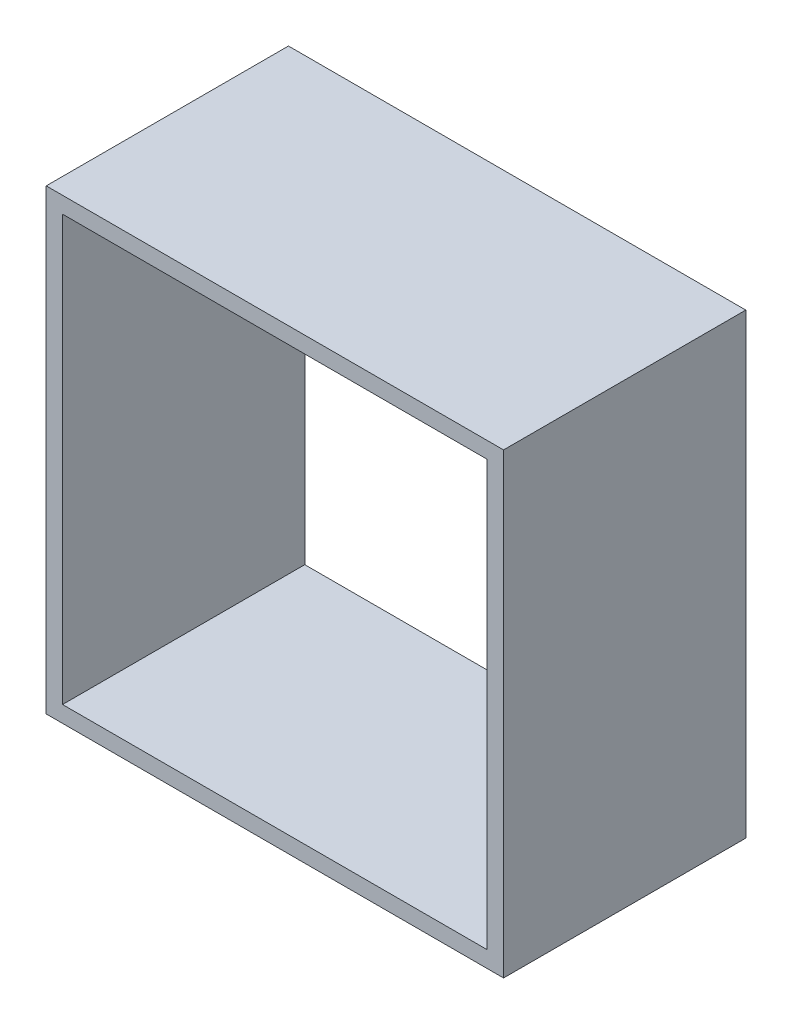
ISO-10303-21;
HEADER;
FILE_DESCRIPTION(('STEP AP214'),'2;1');
FILE_NAME('part.step','',(''),(''),'','','');
FILE_SCHEMA(('AUTOMOTIVE_DESIGN { 1 0 10303 214 1 1 1 1 }'));
ENDSEC;
DATA;
#1=APPLICATION_CONTEXT('core data for automotive mechanical design processes');
#2=APPLICATION_PROTOCOL_DEFINITION('international standard','automotive_design',2000,#1);
#3=PRODUCT_CONTEXT('',#1,'mechanical');
#4=PRODUCT('Part','Part','',(#3));
#5=PRODUCT_RELATED_PRODUCT_CATEGORY('part','',(#4));
#6=PRODUCT_DEFINITION_FORMATION('','',#4);
#7=PRODUCT_DEFINITION_CONTEXT('part definition',#1,'design');
#8=PRODUCT_DEFINITION('design','',#6,#7);
#9=PRODUCT_DEFINITION_SHAPE('','',#8);
#10=(LENGTH_UNIT() NAMED_UNIT(*) SI_UNIT(.MILLI.,.METRE.));
#11=(NAMED_UNIT(*) PLANE_ANGLE_UNIT() SI_UNIT($,.RADIAN.));
#12=(NAMED_UNIT(*) SI_UNIT($,.STERADIAN.) SOLID_ANGLE_UNIT());
#13=UNCERTAINTY_MEASURE_WITH_UNIT(LENGTH_MEASURE(1.E-05),#10,'distance_accuracy_value','');
#14=(GEOMETRIC_REPRESENTATION_CONTEXT(3) GLOBAL_UNCERTAINTY_ASSIGNED_CONTEXT((#13)) GLOBAL_UNIT_ASSIGNED_CONTEXT((#10,
#11,#12)) REPRESENTATION_CONTEXT('',''));
#15=CARTESIAN_POINT('',(0.,0.,0.));
#16=DIRECTION('',(0.,0.,1.));
#17=DIRECTION('',(1.,0.,0.));
#18=AXIS2_PLACEMENT_3D('',#15,#16,#17);
#19=CARTESIAN_POINT('',(-14.,-14.,14.83));
#20=DIRECTION('',(1.,0.,0.));
#21=DIRECTION('',(0.,0.,-1.));
#22=AXIS2_PLACEMENT_3D('',#19,#20,#21);
#23=PLANE('',#22);
#24=DIRECTION('',(0.,-1.,0.));
#25=VECTOR('',#24,1.);
#26=CARTESIAN_POINT('',(-14.,-14.,0.));
#27=LINE('',#26,#25);
#28=CARTESIAN_POINT('',(-14.,14.,0.));
#29=VERTEX_POINT('',#28);
#30=CARTESIAN_POINT('',(-14.,-14.,0.));
#31=VERTEX_POINT('',#30);
#32=EDGE_CURVE('E132',#29,#31,#27,.T.);
#33=ORIENTED_EDGE('',*,*,#32,.T.);
#34=DIRECTION('',(0.,0.,-1.));
#35=VECTOR('',#34,1.);
#36=CARTESIAN_POINT('',(-14.,-14.,14.83));
#37=LINE('',#36,#35);
#38=CARTESIAN_POINT('',(-14.,-14.,14.83));
#39=VERTEX_POINT('',#38);
#40=EDGE_CURVE('E161',#39,#31,#37,.T.);
#41=ORIENTED_EDGE('',*,*,#40,.F.);
#42=DIRECTION('',(0.,-1.,0.));
#43=VECTOR('',#42,1.);
#44=CARTESIAN_POINT('',(-14.,-14.,14.83));
#45=LINE('',#44,#43);
#46=CARTESIAN_POINT('',(-14.,14.,14.83));
#47=VERTEX_POINT('',#46);
#48=EDGE_CURVE('E135',#47,#39,#45,.T.);
#49=ORIENTED_EDGE('',*,*,#48,.F.);
#50=DIRECTION('',(0.,0.,-1.));
#51=VECTOR('',#50,1.);
#52=CARTESIAN_POINT('',(-14.,14.,14.83));
#53=LINE('',#52,#51);
#54=EDGE_CURVE('E145',#47,#29,#53,.T.);
#55=ORIENTED_EDGE('',*,*,#54,.T.);
#56=EDGE_LOOP('',(#33,#41,#49,#55));
#57=FACE_BOUND('',#56,.T.);
#58=ADVANCED_FACE('F43',(#57),#23,.F.);
#59=CARTESIAN_POINT('',(-14.,-14.,14.83));
#60=DIRECTION('',(0.,1.,0.));
#61=DIRECTION('',(0.,0.,1.));
#62=AXIS2_PLACEMENT_3D('',#59,#60,#61);
#63=PLANE('',#62);
#64=DIRECTION('',(1.,0.,0.));
#65=VECTOR('',#64,1.);
#66=CARTESIAN_POINT('',(-14.,-14.,0.));
#67=LINE('',#66,#65);
#68=CARTESIAN_POINT('',(14.,-14.,0.));
#69=VERTEX_POINT('',#68);
#70=EDGE_CURVE('E148',#31,#69,#67,.T.);
#71=ORIENTED_EDGE('',*,*,#70,.T.);
#72=DIRECTION('',(0.,0.,-1.));
#73=VECTOR('',#72,1.);
#74=CARTESIAN_POINT('',(14.,-14.,14.83));
#75=LINE('',#74,#73);
#76=CARTESIAN_POINT('',(14.,-14.,14.83));
#77=VERTEX_POINT('',#76);
#78=EDGE_CURVE('E158',#77,#69,#75,.T.);
#79=ORIENTED_EDGE('',*,*,#78,.F.);
#80=DIRECTION('',(1.,0.,0.));
#81=VECTOR('',#80,1.);
#82=CARTESIAN_POINT('',(-14.,-14.,14.83));
#83=LINE('',#82,#81);
#84=EDGE_CURVE('E138',#39,#77,#83,.T.);
#85=ORIENTED_EDGE('',*,*,#84,.F.);
#86=ORIENTED_EDGE('',*,*,#40,.T.);
#87=EDGE_LOOP('',(#71,#79,#85,#86));
#88=FACE_BOUND('',#87,.T.);
#89=ADVANCED_FACE('F186',(#88),#63,.F.);
#90=CARTESIAN_POINT('',(14.,-14.,14.83));
#91=DIRECTION('',(-1.,0.,0.));
#92=DIRECTION('',(0.,0.,1.));
#93=AXIS2_PLACEMENT_3D('',#90,#91,#92);
#94=PLANE('',#93);
#95=DIRECTION('',(0.,1.,0.));
#96=VECTOR('',#95,1.);
#97=CARTESIAN_POINT('',(14.,-14.,0.));
#98=LINE('',#97,#96);
#99=CARTESIAN_POINT('',(14.,14.,0.));
#100=VERTEX_POINT('',#99);
#101=EDGE_CURVE('E150',#69,#100,#98,.T.);
#102=ORIENTED_EDGE('',*,*,#101,.T.);
#103=DIRECTION('',(0.,0.,-1.));
#104=VECTOR('',#103,1.);
#105=CARTESIAN_POINT('',(14.,14.,14.83));
#106=LINE('',#105,#104);
#107=CARTESIAN_POINT('',(14.,14.,14.83));
#108=VERTEX_POINT('',#107);
#109=EDGE_CURVE('E155',#108,#100,#106,.T.);
#110=ORIENTED_EDGE('',*,*,#109,.F.);
#111=DIRECTION('',(0.,1.,0.));
#112=VECTOR('',#111,1.);
#113=CARTESIAN_POINT('',(14.,-14.,14.83));
#114=LINE('',#113,#112);
#115=EDGE_CURVE('E141',#77,#108,#114,.T.);
#116=ORIENTED_EDGE('',*,*,#115,.F.);
#117=ORIENTED_EDGE('',*,*,#78,.T.);
#118=EDGE_LOOP('',(#102,#110,#116,#117));
#119=FACE_BOUND('',#118,.T.);
#120=ADVANCED_FACE('F191',(#119),#94,.F.);
#121=CARTESIAN_POINT('',(-14.,14.,14.83));
#122=DIRECTION('',(0.,-1.,0.));
#123=DIRECTION('',(0.,0.,-1.));
#124=AXIS2_PLACEMENT_3D('',#121,#122,#123);
#125=PLANE('',#124);
#126=DIRECTION('',(-1.,0.,0.));
#127=VECTOR('',#126,1.);
#128=CARTESIAN_POINT('',(-14.,14.,0.));
#129=LINE('',#128,#127);
#130=EDGE_CURVE('E139',#100,#29,#129,.T.);
#131=ORIENTED_EDGE('',*,*,#130,.T.);
#132=ORIENTED_EDGE('',*,*,#54,.F.);
#133=DIRECTION('',(-1.,0.,0.));
#134=VECTOR('',#133,1.);
#135=CARTESIAN_POINT('',(-14.,14.,14.83));
#136=LINE('',#135,#134);
#137=EDGE_CURVE('E143',#108,#47,#136,.T.);
#138=ORIENTED_EDGE('',*,*,#137,.F.);
#139=ORIENTED_EDGE('',*,*,#109,.T.);
#140=EDGE_LOOP('',(#131,#132,#138,#139));
#141=FACE_BOUND('',#140,.T.);
#142=ADVANCED_FACE('F204',(#141),#125,.F.);
#143=CARTESIAN_POINT('',(0.,0.,14.83));
#144=DIRECTION('',(0.,0.,-1.));
#145=DIRECTION('',(-1.,0.,0.));
#146=AXIS2_PLACEMENT_3D('',#143,#144,#145);
#147=PLANE('',#146);
#148=DIRECTION('',(1.,0.,0.));
#149=VECTOR('',#148,1.);
#150=CARTESIAN_POINT('',(-13.,-13.,14.83));
#151=LINE('',#150,#149);
#152=CARTESIAN_POINT('',(-13.,-13.,14.83));
#153=VERTEX_POINT('',#152);
#154=CARTESIAN_POINT('',(13.,-13.,14.83));
#155=VERTEX_POINT('',#154);
#156=EDGE_CURVE('E118',#153,#155,#151,.T.);
#157=ORIENTED_EDGE('',*,*,#156,.F.);
#158=DIRECTION('',(0.,-1.,0.));
#159=VECTOR('',#158,1.);
#160=CARTESIAN_POINT('',(-13.,-13.,14.83));
#161=LINE('',#160,#159);
#162=CARTESIAN_POINT('',(-13.,13.,14.83));
#163=VERTEX_POINT('',#162);
#164=EDGE_CURVE('E57',#163,#153,#161,.T.);
#165=ORIENTED_EDGE('',*,*,#164,.F.);
#166=DIRECTION('',(-1.,0.,0.));
#167=VECTOR('',#166,1.);
#168=CARTESIAN_POINT('',(-13.,13.,14.83));
#169=LINE('',#168,#167);
#170=CARTESIAN_POINT('',(13.,13.,14.83));
#171=VERTEX_POINT('',#170);
#172=EDGE_CURVE('E125',#171,#163,#169,.T.);
#173=ORIENTED_EDGE('',*,*,#172,.F.);
#174=DIRECTION('',(0.,1.,0.));
#175=VECTOR('',#174,1.);
#176=CARTESIAN_POINT('',(13.,-13.,14.83));
#177=LINE('',#176,#175);
#178=EDGE_CURVE('E109',#155,#171,#177,.T.);
#179=ORIENTED_EDGE('',*,*,#178,.F.);
#180=EDGE_LOOP('',(#157,#165,#173,#179));
#181=FACE_BOUND('',#180,.T.);
#182=ORIENTED_EDGE('',*,*,#48,.T.);
#183=ORIENTED_EDGE('',*,*,#84,.T.);
#184=ORIENTED_EDGE('',*,*,#115,.T.);
#185=ORIENTED_EDGE('',*,*,#137,.T.);
#186=EDGE_LOOP('',(#182,#183,#184,#185));
#187=FACE_BOUND('',#186,.T.);
#188=ADVANCED_FACE('F122',(#181,#187),#147,.F.);
#189=CARTESIAN_POINT('',(0.,0.,0.));
#190=DIRECTION('',(0.,0.,-1.));
#191=DIRECTION('',(-1.,0.,0.));
#192=AXIS2_PLACEMENT_3D('',#189,#190,#191);
#193=PLANE('',#192);
#194=DIRECTION('',(0.,1.,0.));
#195=VECTOR('',#194,1.);
#196=CARTESIAN_POINT('',(-13.,0.,0.));
#197=LINE('',#196,#195);
#198=CARTESIAN_POINT('',(-13.,-13.,0.));
#199=VERTEX_POINT('',#198);
#200=CARTESIAN_POINT('',(-13.,13.,0.));
#201=VERTEX_POINT('',#200);
#202=EDGE_CURVE('E11',#199,#201,#197,.T.);
#203=ORIENTED_EDGE('',*,*,#202,.F.);
#204=DIRECTION('',(-1.,0.,0.));
#205=VECTOR('',#204,1.);
#206=CARTESIAN_POINT('',(0.,-13.,0.));
#207=LINE('',#206,#205);
#208=CARTESIAN_POINT('',(13.,-13.,0.));
#209=VERTEX_POINT('',#208);
#210=EDGE_CURVE('E164',#209,#199,#207,.T.);
#211=ORIENTED_EDGE('',*,*,#210,.F.);
#212=DIRECTION('',(0.,-1.,0.));
#213=VECTOR('',#212,1.);
#214=CARTESIAN_POINT('',(13.,0.,0.));
#215=LINE('',#214,#213);
#216=CARTESIAN_POINT('',(13.,13.,0.));
#217=VERTEX_POINT('',#216);
#218=EDGE_CURVE('E112',#217,#209,#215,.T.);
#219=ORIENTED_EDGE('',*,*,#218,.F.);
#220=DIRECTION('',(1.,0.,0.));
#221=VECTOR('',#220,1.);
#222=CARTESIAN_POINT('',(0.,13.,0.));
#223=LINE('',#222,#221);
#224=EDGE_CURVE('E50',#201,#217,#223,.T.);
#225=ORIENTED_EDGE('',*,*,#224,.F.);
#226=EDGE_LOOP('',(#203,#211,#219,#225));
#227=FACE_BOUND('',#226,.T.);
#228=ORIENTED_EDGE('',*,*,#32,.F.);
#229=ORIENTED_EDGE('',*,*,#130,.F.);
#230=ORIENTED_EDGE('',*,*,#101,.F.);
#231=ORIENTED_EDGE('',*,*,#70,.F.);
#232=EDGE_LOOP('',(#228,#229,#230,#231));
#233=FACE_BOUND('',#232,.T.);
#234=ADVANCED_FACE('F172',(#227,#233),#193,.T.);
#235=CARTESIAN_POINT('',(-13.,-13.,-35.17));
#236=DIRECTION('',(-1.,0.,0.));
#237=DIRECTION('',(0.,0.,1.));
#238=AXIS2_PLACEMENT_3D('',#235,#236,#237);
#239=PLANE('',#238);
#240=ORIENTED_EDGE('',*,*,#202,.T.);
#241=DIRECTION('',(0.,0.,1.));
#242=VECTOR('',#241,1.);
#243=CARTESIAN_POINT('',(-13.,13.,-35.17));
#244=LINE('',#243,#242);
#245=EDGE_CURVE('E130',#201,#163,#244,.T.);
#246=ORIENTED_EDGE('',*,*,#245,.T.);
#247=ORIENTED_EDGE('',*,*,#164,.T.);
#248=DIRECTION('',(0.,0.,1.));
#249=VECTOR('',#248,1.);
#250=CARTESIAN_POINT('',(-13.,-13.,-35.17));
#251=LINE('',#250,#249);
#252=EDGE_CURVE('E115',#199,#153,#251,.T.);
#253=ORIENTED_EDGE('',*,*,#252,.F.);
#254=EDGE_LOOP('',(#240,#246,#247,#253));
#255=FACE_BOUND('',#254,.T.);
#256=ADVANCED_FACE('F174',(#255),#239,.F.);
#257=CARTESIAN_POINT('',(-13.,13.,-35.17));
#258=DIRECTION('',(0.,1.,0.));
#259=DIRECTION('',(0.,0.,1.));
#260=AXIS2_PLACEMENT_3D('',#257,#258,#259);
#261=PLANE('',#260);
#262=ORIENTED_EDGE('',*,*,#224,.T.);
#263=DIRECTION('',(0.,0.,1.));
#264=VECTOR('',#263,1.);
#265=CARTESIAN_POINT('',(13.,13.,-35.17));
#266=LINE('',#265,#264);
#267=EDGE_CURVE('E114',#217,#171,#266,.T.);
#268=ORIENTED_EDGE('',*,*,#267,.T.);
#269=ORIENTED_EDGE('',*,*,#172,.T.);
#270=ORIENTED_EDGE('',*,*,#245,.F.);
#271=EDGE_LOOP('',(#262,#268,#269,#270));
#272=FACE_BOUND('',#271,.T.);
#273=ADVANCED_FACE('F169',(#272),#261,.F.);
#274=CARTESIAN_POINT('',(13.,-13.,-35.17));
#275=DIRECTION('',(1.,0.,0.));
#276=DIRECTION('',(0.,0.,-1.));
#277=AXIS2_PLACEMENT_3D('',#274,#275,#276);
#278=PLANE('',#277);
#279=ORIENTED_EDGE('',*,*,#218,.T.);
#280=DIRECTION('',(0.,0.,1.));
#281=VECTOR('',#280,1.);
#282=CARTESIAN_POINT('',(13.,-13.,-35.17));
#283=LINE('',#282,#281);
#284=EDGE_CURVE('E65',#209,#155,#283,.T.);
#285=ORIENTED_EDGE('',*,*,#284,.T.);
#286=ORIENTED_EDGE('',*,*,#178,.T.);
#287=ORIENTED_EDGE('',*,*,#267,.F.);
#288=EDGE_LOOP('',(#279,#285,#286,#287));
#289=FACE_BOUND('',#288,.T.);
#290=ADVANCED_FACE('F106',(#289),#278,.F.);
#291=CARTESIAN_POINT('',(-13.,-13.,-35.17));
#292=DIRECTION('',(0.,-1.,0.));
#293=DIRECTION('',(0.,0.,-1.));
#294=AXIS2_PLACEMENT_3D('',#291,#292,#293);
#295=PLANE('',#294);
#296=ORIENTED_EDGE('',*,*,#210,.T.);
#297=ORIENTED_EDGE('',*,*,#252,.T.);
#298=ORIENTED_EDGE('',*,*,#156,.T.);
#299=ORIENTED_EDGE('',*,*,#284,.F.);
#300=EDGE_LOOP('',(#296,#297,#298,#299));
#301=FACE_BOUND('',#300,.T.);
#302=ADVANCED_FACE('F119',(#301),#295,.F.);
#303=CLOSED_SHELL('',(#58,#89,#120,#142,#188,#234,#256,#273,#290,#302));
#304=MANIFOLD_SOLID_BREP('B2',#303);
#305=ADVANCED_BREP_SHAPE_REPRESENTATION('',(#18,#304),#14);
#306=SHAPE_DEFINITION_REPRESENTATION(#9,#305);
ENDSEC;
END-ISO-10303-21;
